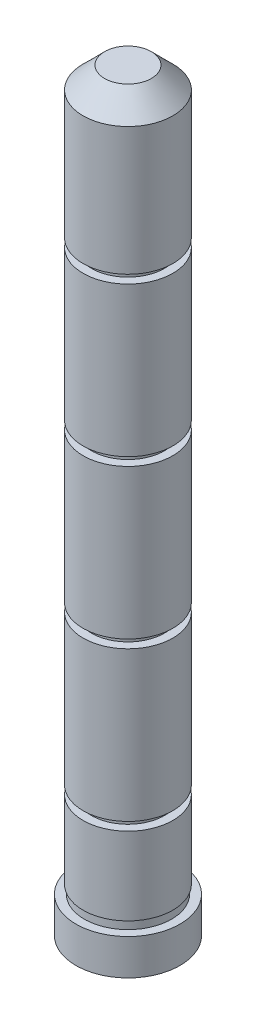
ISO-10303-21;
HEADER;
FILE_DESCRIPTION(('STEP AP214'),'2;1');
FILE_NAME('part.step','',(''),(''),'','','');
FILE_SCHEMA(('AUTOMOTIVE_DESIGN { 1 0 10303 214 1 1 1 1 }'));
ENDSEC;
DATA;
#1=APPLICATION_CONTEXT('core data for automotive mechanical design processes');
#2=APPLICATION_PROTOCOL_DEFINITION('international standard','automotive_design',2000,#1);
#3=PRODUCT_CONTEXT('',#1,'mechanical');
#4=PRODUCT('Part','Part','',(#3));
#5=PRODUCT_RELATED_PRODUCT_CATEGORY('part','',(#4));
#6=PRODUCT_DEFINITION_FORMATION('','',#4);
#7=PRODUCT_DEFINITION_CONTEXT('part definition',#1,'design');
#8=PRODUCT_DEFINITION('design','',#6,#7);
#9=PRODUCT_DEFINITION_SHAPE('','',#8);
#10=(LENGTH_UNIT() NAMED_UNIT(*) SI_UNIT(.MILLI.,.METRE.));
#11=(NAMED_UNIT(*) PLANE_ANGLE_UNIT() SI_UNIT($,.RADIAN.));
#12=(NAMED_UNIT(*) SI_UNIT($,.STERADIAN.) SOLID_ANGLE_UNIT());
#13=UNCERTAINTY_MEASURE_WITH_UNIT(LENGTH_MEASURE(1.E-05),#10,'distance_accuracy_value','');
#14=(GEOMETRIC_REPRESENTATION_CONTEXT(3) GLOBAL_UNCERTAINTY_ASSIGNED_CONTEXT((#13)) GLOBAL_UNIT_ASSIGNED_CONTEXT((#10,
#11,#12)) REPRESENTATION_CONTEXT('',''));
#15=CARTESIAN_POINT('',(0.,0.,0.));
#16=DIRECTION('',(0.,0.,1.));
#17=DIRECTION('',(1.,0.,0.));
#18=AXIS2_PLACEMENT_3D('',#15,#16,#17);
#19=CARTESIAN_POINT('',(0.,0.,0.));
#20=DIRECTION('',(0.,1.,0.));
#21=DIRECTION('',(-1.,0.,0.));
#22=AXIS2_PLACEMENT_3D('',#19,#20,#21);
#23=PLANE('',#22);
#24=CARTESIAN_POINT('',(0.,0.,0.));
#25=DIRECTION('',(0.,1.,0.));
#26=DIRECTION('',(-1.,0.,0.));
#27=AXIS2_PLACEMENT_3D('',#24,#25,#26);
#28=CIRCLE('',#27,14.5);
#29=CARTESIAN_POINT('',(-14.5,0.,0.));
#30=VERTEX_POINT('',#29);
#31=EDGE_CURVE('E55',#30,#30,#28,.T.);
#32=ORIENTED_EDGE('',*,*,#31,.F.);
#33=EDGE_LOOP('',(#32));
#34=FACE_BOUND('',#33,.T.);
#35=ADVANCED_FACE('F43',(#34),#23,.F.);
#36=CARTESIAN_POINT('',(0.,210.,0.));
#37=DIRECTION('',(0.,1.,0.));
#38=DIRECTION('',(-1.,0.,0.));
#39=AXIS2_PLACEMENT_3D('',#36,#37,#38);
#40=CYLINDRICAL_SURFACE('',#39,14.5);
#41=CARTESIAN_POINT('',(0.,10.,0.));
#42=DIRECTION('',(0.,1.,0.));
#43=DIRECTION('',(-1.,0.,0.));
#44=AXIS2_PLACEMENT_3D('',#41,#42,#43);
#45=CIRCLE('',#44,14.5);
#46=CARTESIAN_POINT('',(-14.5,10.,0.));
#47=VERTEX_POINT('',#46);
#48=EDGE_CURVE('E59',#47,#47,#45,.T.);
#49=ORIENTED_EDGE('',*,*,#48,.F.);
#50=EDGE_LOOP('',(#49));
#51=FACE_BOUND('',#50,.T.);
#52=ORIENTED_EDGE('',*,*,#31,.T.);
#53=EDGE_LOOP('',(#52));
#54=FACE_BOUND('',#53,.T.);
#55=ADVANCED_FACE('F235',(#51,#54),#40,.T.);
#56=CARTESIAN_POINT('',(14.5,10.,0.));
#57=DIRECTION('',(0.,-1.,0.));
#58=DIRECTION('',(1.,0.,0.));
#59=AXIS2_PLACEMENT_3D('',#56,#57,#58);
#60=PLANE('',#59);
#61=CARTESIAN_POINT('',(0.,10.,0.));
#62=DIRECTION('',(0.,1.,0.));
#63=DIRECTION('',(-1.,0.,0.));
#64=AXIS2_PLACEMENT_3D('',#61,#62,#63);
#65=CIRCLE('',#64,12.15);
#66=CARTESIAN_POINT('',(-12.15,10.,0.));
#67=VERTEX_POINT('',#66);
#68=EDGE_CURVE('E64',#67,#67,#65,.T.);
#69=ORIENTED_EDGE('',*,*,#68,.F.);
#70=EDGE_LOOP('',(#69));
#71=FACE_BOUND('',#70,.T.);
#72=ORIENTED_EDGE('',*,*,#48,.T.);
#73=EDGE_LOOP('',(#72));
#74=FACE_BOUND('',#73,.T.);
#75=ADVANCED_FACE('F229',(#71,#74),#60,.F.);
#76=CARTESIAN_POINT('',(0.,210.,0.));
#77=DIRECTION('',(0.,1.,0.));
#78=DIRECTION('',(-1.,0.,0.));
#79=AXIS2_PLACEMENT_3D('',#76,#77,#78);
#80=CYLINDRICAL_SURFACE('',#79,12.15);
#81=CARTESIAN_POINT('',(0.,12.35,0.));
#82=DIRECTION('',(0.,1.,0.));
#83=DIRECTION('',(-1.,0.,0.));
#84=AXIS2_PLACEMENT_3D('',#81,#82,#83);
#85=CIRCLE('',#84,12.15);
#86=CARTESIAN_POINT('',(-12.15,12.35,0.));
#87=VERTEX_POINT('',#86);
#88=EDGE_CURVE('E67',#87,#87,#85,.T.);
#89=ORIENTED_EDGE('',*,*,#88,.F.);
#90=EDGE_LOOP('',(#89));
#91=FACE_BOUND('',#90,.T.);
#92=ORIENTED_EDGE('',*,*,#68,.T.);
#93=EDGE_LOOP('',(#92));
#94=FACE_BOUND('',#93,.T.);
#95=ADVANCED_FACE('F223',(#91,#94),#80,.T.);
#96=CARTESIAN_POINT('',(12.15,12.35,0.));
#97=DIRECTION('',(0.,1.,0.));
#98=DIRECTION('',(-1.,0.,0.));
#99=AXIS2_PLACEMENT_3D('',#96,#97,#98);
#100=PLANE('',#99);
#101=CARTESIAN_POINT('',(0.,12.35,0.));
#102=DIRECTION('',(0.,1.,0.));
#103=DIRECTION('',(-1.,0.,0.));
#104=AXIS2_PLACEMENT_3D('',#101,#102,#103);
#105=CIRCLE('',#104,12.5);
#106=CARTESIAN_POINT('',(-12.5,12.35,0.));
#107=VERTEX_POINT('',#106);
#108=EDGE_CURVE('E70',#107,#107,#105,.T.);
#109=ORIENTED_EDGE('',*,*,#108,.F.);
#110=EDGE_LOOP('',(#109));
#111=FACE_BOUND('',#110,.T.);
#112=ORIENTED_EDGE('',*,*,#88,.T.);
#113=EDGE_LOOP('',(#112));
#114=FACE_BOUND('',#113,.T.);
#115=ADVANCED_FACE('F217',(#111,#114),#100,.F.);
#116=CARTESIAN_POINT('',(0.,210.,0.));
#117=DIRECTION('',(0.,1.,0.));
#118=DIRECTION('',(-1.,0.,0.));
#119=AXIS2_PLACEMENT_3D('',#116,#117,#118);
#120=CYLINDRICAL_SURFACE('',#119,12.5);
#121=CARTESIAN_POINT('',(0.,34.,0.));
#122=DIRECTION('',(0.,1.,0.));
#123=DIRECTION('',(-1.,0.,0.));
#124=AXIS2_PLACEMENT_3D('',#121,#122,#123);
#125=CIRCLE('',#124,12.5);
#126=CARTESIAN_POINT('',(-12.5,34.,0.));
#127=VERTEX_POINT('',#126);
#128=EDGE_CURVE('E73',#127,#127,#125,.T.);
#129=ORIENTED_EDGE('',*,*,#128,.F.);
#130=EDGE_LOOP('',(#129));
#131=FACE_BOUND('',#130,.T.);
#132=ORIENTED_EDGE('',*,*,#108,.T.);
#133=EDGE_LOOP('',(#132));
#134=FACE_BOUND('',#133,.T.);
#135=ADVANCED_FACE('F211',(#131,#134),#120,.T.);
#136=CARTESIAN_POINT('',(12.5,34.,0.));
#137=DIRECTION('',(0.,-1.,0.));
#138=DIRECTION('',(1.,0.,0.));
#139=AXIS2_PLACEMENT_3D('',#136,#137,#138);
#140=PLANE('',#139);
#141=CARTESIAN_POINT('',(0.,34.,0.));
#142=DIRECTION('',(0.,1.,0.));
#143=DIRECTION('',(-1.,0.,0.));
#144=AXIS2_PLACEMENT_3D('',#141,#142,#143);
#145=CIRCLE('',#144,10.15);
#146=CARTESIAN_POINT('',(-10.15,34.,0.));
#147=VERTEX_POINT('',#146);
#148=EDGE_CURVE('E76',#147,#147,#145,.T.);
#149=ORIENTED_EDGE('',*,*,#148,.F.);
#150=EDGE_LOOP('',(#149));
#151=FACE_BOUND('',#150,.T.);
#152=ORIENTED_EDGE('',*,*,#128,.T.);
#153=EDGE_LOOP('',(#152));
#154=FACE_BOUND('',#153,.T.);
#155=ADVANCED_FACE('F205',(#151,#154),#140,.F.);
#156=CARTESIAN_POINT('',(0.,210.,0.));
#157=DIRECTION('',(0.,1.,0.));
#158=DIRECTION('',(-1.,0.,0.));
#159=AXIS2_PLACEMENT_3D('',#156,#157,#158);
#160=CYLINDRICAL_SURFACE('',#159,10.15);
#161=CARTESIAN_POINT('',(0.,36.35,0.));
#162=DIRECTION('',(0.,1.,0.));
#163=DIRECTION('',(-1.,0.,0.));
#164=AXIS2_PLACEMENT_3D('',#161,#162,#163);
#165=CIRCLE('',#164,10.15);
#166=CARTESIAN_POINT('',(-10.15,36.35,0.));
#167=VERTEX_POINT('',#166);
#168=EDGE_CURVE('E79',#167,#167,#165,.T.);
#169=ORIENTED_EDGE('',*,*,#168,.F.);
#170=EDGE_LOOP('',(#169));
#171=FACE_BOUND('',#170,.T.);
#172=ORIENTED_EDGE('',*,*,#148,.T.);
#173=EDGE_LOOP('',(#172));
#174=FACE_BOUND('',#173,.T.);
#175=ADVANCED_FACE('F199',(#171,#174),#160,.T.);
#176=CARTESIAN_POINT('',(10.15,36.35,0.));
#177=DIRECTION('',(0.,1.,0.));
#178=DIRECTION('',(-1.,0.,0.));
#179=AXIS2_PLACEMENT_3D('',#176,#177,#178);
#180=PLANE('',#179);
#181=CARTESIAN_POINT('',(0.,36.35,0.));
#182=DIRECTION('',(0.,1.,0.));
#183=DIRECTION('',(-1.,0.,0.));
#184=AXIS2_PLACEMENT_3D('',#181,#182,#183);
#185=CIRCLE('',#184,12.5);
#186=CARTESIAN_POINT('',(-12.5,36.35,0.));
#187=VERTEX_POINT('',#186);
#188=EDGE_CURVE('E82',#187,#187,#185,.T.);
#189=ORIENTED_EDGE('',*,*,#188,.F.);
#190=EDGE_LOOP('',(#189));
#191=FACE_BOUND('',#190,.T.);
#192=ORIENTED_EDGE('',*,*,#168,.T.);
#193=EDGE_LOOP('',(#192));
#194=FACE_BOUND('',#193,.T.);
#195=ADVANCED_FACE('F193',(#191,#194),#180,.F.);
#196=CARTESIAN_POINT('',(0.,210.,0.));
#197=DIRECTION('',(0.,1.,0.));
#198=DIRECTION('',(-1.,0.,0.));
#199=AXIS2_PLACEMENT_3D('',#196,#197,#198);
#200=CYLINDRICAL_SURFACE('',#199,12.5);
#201=CARTESIAN_POINT('',(0.,78.,0.));
#202=DIRECTION('',(0.,1.,0.));
#203=DIRECTION('',(-1.,0.,0.));
#204=AXIS2_PLACEMENT_3D('',#201,#202,#203);
#205=CIRCLE('',#204,12.5);
#206=CARTESIAN_POINT('',(-12.5,78.,0.));
#207=VERTEX_POINT('',#206);
#208=EDGE_CURVE('E85',#207,#207,#205,.T.);
#209=ORIENTED_EDGE('',*,*,#208,.F.);
#210=EDGE_LOOP('',(#209));
#211=FACE_BOUND('',#210,.T.);
#212=ORIENTED_EDGE('',*,*,#188,.T.);
#213=EDGE_LOOP('',(#212));
#214=FACE_BOUND('',#213,.T.);
#215=ADVANCED_FACE('F187',(#211,#214),#200,.T.);
#216=CARTESIAN_POINT('',(12.5,78.,0.));
#217=DIRECTION('',(0.,-1.,0.));
#218=DIRECTION('',(1.,0.,0.));
#219=AXIS2_PLACEMENT_3D('',#216,#217,#218);
#220=PLANE('',#219);
#221=CARTESIAN_POINT('',(0.,78.,0.));
#222=DIRECTION('',(0.,1.,0.));
#223=DIRECTION('',(-1.,0.,0.));
#224=AXIS2_PLACEMENT_3D('',#221,#222,#223);
#225=CIRCLE('',#224,10.15);
#226=CARTESIAN_POINT('',(-10.15,78.,0.));
#227=VERTEX_POINT('',#226);
#228=EDGE_CURVE('E88',#227,#227,#225,.T.);
#229=ORIENTED_EDGE('',*,*,#228,.F.);
#230=EDGE_LOOP('',(#229));
#231=FACE_BOUND('',#230,.T.);
#232=ORIENTED_EDGE('',*,*,#208,.T.);
#233=EDGE_LOOP('',(#232));
#234=FACE_BOUND('',#233,.T.);
#235=ADVANCED_FACE('F181',(#231,#234),#220,.F.);
#236=CARTESIAN_POINT('',(0.,210.,0.));
#237=DIRECTION('',(0.,1.,0.));
#238=DIRECTION('',(-1.,0.,0.));
#239=AXIS2_PLACEMENT_3D('',#236,#237,#238);
#240=CYLINDRICAL_SURFACE('',#239,10.15);
#241=CARTESIAN_POINT('',(0.,80.35,0.));
#242=DIRECTION('',(0.,1.,0.));
#243=DIRECTION('',(-1.,0.,0.));
#244=AXIS2_PLACEMENT_3D('',#241,#242,#243);
#245=CIRCLE('',#244,10.15);
#246=CARTESIAN_POINT('',(-10.15,80.35,0.));
#247=VERTEX_POINT('',#246);
#248=EDGE_CURVE('E91',#247,#247,#245,.T.);
#249=ORIENTED_EDGE('',*,*,#248,.F.);
#250=EDGE_LOOP('',(#249));
#251=FACE_BOUND('',#250,.T.);
#252=ORIENTED_EDGE('',*,*,#228,.T.);
#253=EDGE_LOOP('',(#252));
#254=FACE_BOUND('',#253,.T.);
#255=ADVANCED_FACE('F175',(#251,#254),#240,.T.);
#256=CARTESIAN_POINT('',(10.15,80.35,0.));
#257=DIRECTION('',(0.,1.,0.));
#258=DIRECTION('',(-1.,0.,0.));
#259=AXIS2_PLACEMENT_3D('',#256,#257,#258);
#260=PLANE('',#259);
#261=CARTESIAN_POINT('',(0.,80.35,0.));
#262=DIRECTION('',(0.,1.,0.));
#263=DIRECTION('',(-1.,0.,0.));
#264=AXIS2_PLACEMENT_3D('',#261,#262,#263);
#265=CIRCLE('',#264,12.5);
#266=CARTESIAN_POINT('',(-12.5,80.35,0.));
#267=VERTEX_POINT('',#266);
#268=EDGE_CURVE('E94',#267,#267,#265,.T.);
#269=ORIENTED_EDGE('',*,*,#268,.F.);
#270=EDGE_LOOP('',(#269));
#271=FACE_BOUND('',#270,.T.);
#272=ORIENTED_EDGE('',*,*,#248,.T.);
#273=EDGE_LOOP('',(#272));
#274=FACE_BOUND('',#273,.T.);
#275=ADVANCED_FACE('F169',(#271,#274),#260,.F.);
#276=CARTESIAN_POINT('',(0.,210.,0.));
#277=DIRECTION('',(0.,1.,0.));
#278=DIRECTION('',(-1.,0.,0.));
#279=AXIS2_PLACEMENT_3D('',#276,#277,#278);
#280=CYLINDRICAL_SURFACE('',#279,12.5);
#281=CARTESIAN_POINT('',(0.,122.,0.));
#282=DIRECTION('',(0.,1.,0.));
#283=DIRECTION('',(-1.,0.,0.));
#284=AXIS2_PLACEMENT_3D('',#281,#282,#283);
#285=CIRCLE('',#284,12.5);
#286=CARTESIAN_POINT('',(-12.5,122.,0.));
#287=VERTEX_POINT('',#286);
#288=EDGE_CURVE('E97',#287,#287,#285,.T.);
#289=ORIENTED_EDGE('',*,*,#288,.F.);
#290=EDGE_LOOP('',(#289));
#291=FACE_BOUND('',#290,.T.);
#292=ORIENTED_EDGE('',*,*,#268,.T.);
#293=EDGE_LOOP('',(#292));
#294=FACE_BOUND('',#293,.T.);
#295=ADVANCED_FACE('F163',(#291,#294),#280,.T.);
#296=CARTESIAN_POINT('',(12.5,122.,0.));
#297=DIRECTION('',(0.,-1.,0.));
#298=DIRECTION('',(1.,0.,0.));
#299=AXIS2_PLACEMENT_3D('',#296,#297,#298);
#300=PLANE('',#299);
#301=CARTESIAN_POINT('',(0.,122.,0.));
#302=DIRECTION('',(0.,1.,0.));
#303=DIRECTION('',(-1.,0.,0.));
#304=AXIS2_PLACEMENT_3D('',#301,#302,#303);
#305=CIRCLE('',#304,10.15);
#306=CARTESIAN_POINT('',(-10.15,122.,0.));
#307=VERTEX_POINT('',#306);
#308=EDGE_CURVE('E100',#307,#307,#305,.T.);
#309=ORIENTED_EDGE('',*,*,#308,.F.);
#310=EDGE_LOOP('',(#309));
#311=FACE_BOUND('',#310,.T.);
#312=ORIENTED_EDGE('',*,*,#288,.T.);
#313=EDGE_LOOP('',(#312));
#314=FACE_BOUND('',#313,.T.);
#315=ADVANCED_FACE('F157',(#311,#314),#300,.F.);
#316=CARTESIAN_POINT('',(0.,210.,0.));
#317=DIRECTION('',(0.,1.,0.));
#318=DIRECTION('',(-1.,0.,0.));
#319=AXIS2_PLACEMENT_3D('',#316,#317,#318);
#320=CYLINDRICAL_SURFACE('',#319,10.15);
#321=CARTESIAN_POINT('',(0.,124.35,0.));
#322=DIRECTION('',(0.,1.,0.));
#323=DIRECTION('',(-1.,0.,0.));
#324=AXIS2_PLACEMENT_3D('',#321,#322,#323);
#325=CIRCLE('',#324,10.15);
#326=CARTESIAN_POINT('',(-10.15,124.35,0.));
#327=VERTEX_POINT('',#326);
#328=EDGE_CURVE('E103',#327,#327,#325,.T.);
#329=ORIENTED_EDGE('',*,*,#328,.F.);
#330=EDGE_LOOP('',(#329));
#331=FACE_BOUND('',#330,.T.);
#332=ORIENTED_EDGE('',*,*,#308,.T.);
#333=EDGE_LOOP('',(#332));
#334=FACE_BOUND('',#333,.T.);
#335=ADVANCED_FACE('F151',(#331,#334),#320,.T.);
#336=CARTESIAN_POINT('',(10.15,124.35,0.));
#337=DIRECTION('',(0.,1.,0.));
#338=DIRECTION('',(-1.,0.,0.));
#339=AXIS2_PLACEMENT_3D('',#336,#337,#338);
#340=PLANE('',#339);
#341=CARTESIAN_POINT('',(0.,124.35,0.));
#342=DIRECTION('',(0.,1.,0.));
#343=DIRECTION('',(-1.,0.,0.));
#344=AXIS2_PLACEMENT_3D('',#341,#342,#343);
#345=CIRCLE('',#344,12.5);
#346=CARTESIAN_POINT('',(-12.5,124.35,0.));
#347=VERTEX_POINT('',#346);
#348=EDGE_CURVE('E106',#347,#347,#345,.T.);
#349=ORIENTED_EDGE('',*,*,#348,.F.);
#350=EDGE_LOOP('',(#349));
#351=FACE_BOUND('',#350,.T.);
#352=ORIENTED_EDGE('',*,*,#328,.T.);
#353=EDGE_LOOP('',(#352));
#354=FACE_BOUND('',#353,.T.);
#355=ADVANCED_FACE('F145',(#351,#354),#340,.F.);
#356=CARTESIAN_POINT('',(0.,210.,0.));
#357=DIRECTION('',(0.,1.,0.));
#358=DIRECTION('',(-1.,0.,0.));
#359=AXIS2_PLACEMENT_3D('',#356,#357,#358);
#360=CYLINDRICAL_SURFACE('',#359,12.5);
#361=CARTESIAN_POINT('',(0.,166.,0.));
#362=DIRECTION('',(0.,1.,0.));
#363=DIRECTION('',(-1.,0.,0.));
#364=AXIS2_PLACEMENT_3D('',#361,#362,#363);
#365=CIRCLE('',#364,12.5);
#366=CARTESIAN_POINT('',(-12.5,166.,0.));
#367=VERTEX_POINT('',#366);
#368=EDGE_CURVE('E109',#367,#367,#365,.T.);
#369=ORIENTED_EDGE('',*,*,#368,.F.);
#370=EDGE_LOOP('',(#369));
#371=FACE_BOUND('',#370,.T.);
#372=ORIENTED_EDGE('',*,*,#348,.T.);
#373=EDGE_LOOP('',(#372));
#374=FACE_BOUND('',#373,.T.);
#375=ADVANCED_FACE('F139',(#371,#374),#360,.T.);
#376=CARTESIAN_POINT('',(12.5,166.,0.));
#377=DIRECTION('',(0.,-1.,0.));
#378=DIRECTION('',(1.,0.,0.));
#379=AXIS2_PLACEMENT_3D('',#376,#377,#378);
#380=PLANE('',#379);
#381=CARTESIAN_POINT('',(0.,166.,0.));
#382=DIRECTION('',(0.,1.,0.));
#383=DIRECTION('',(-1.,0.,0.));
#384=AXIS2_PLACEMENT_3D('',#381,#382,#383);
#385=CIRCLE('',#384,10.15);
#386=CARTESIAN_POINT('',(-10.15,166.,0.));
#387=VERTEX_POINT('',#386);
#388=EDGE_CURVE('E112',#387,#387,#385,.T.);
#389=ORIENTED_EDGE('',*,*,#388,.F.);
#390=EDGE_LOOP('',(#389));
#391=FACE_BOUND('',#390,.T.);
#392=ORIENTED_EDGE('',*,*,#368,.T.);
#393=EDGE_LOOP('',(#392));
#394=FACE_BOUND('',#393,.T.);
#395=ADVANCED_FACE('F133',(#391,#394),#380,.F.);
#396=CARTESIAN_POINT('',(0.,210.,0.));
#397=DIRECTION('',(0.,1.,0.));
#398=DIRECTION('',(-1.,0.,0.));
#399=AXIS2_PLACEMENT_3D('',#396,#397,#398);
#400=CYLINDRICAL_SURFACE('',#399,10.15);
#401=CARTESIAN_POINT('',(0.,168.35,0.));
#402=DIRECTION('',(0.,1.,0.));
#403=DIRECTION('',(-1.,0.,0.));
#404=AXIS2_PLACEMENT_3D('',#401,#402,#403);
#405=CIRCLE('',#404,10.15);
#406=CARTESIAN_POINT('',(-10.15,168.35,0.));
#407=VERTEX_POINT('',#406);
#408=EDGE_CURVE('E115',#407,#407,#405,.T.);
#409=ORIENTED_EDGE('',*,*,#408,.F.);
#410=EDGE_LOOP('',(#409));
#411=FACE_BOUND('',#410,.T.);
#412=ORIENTED_EDGE('',*,*,#388,.T.);
#413=EDGE_LOOP('',(#412));
#414=FACE_BOUND('',#413,.T.);
#415=ADVANCED_FACE('F127',(#411,#414),#400,.T.);
#416=CARTESIAN_POINT('',(10.15,168.35,0.));
#417=DIRECTION('',(0.,1.,0.));
#418=DIRECTION('',(-1.,0.,0.));
#419=AXIS2_PLACEMENT_3D('',#416,#417,#418);
#420=PLANE('',#419);
#421=CARTESIAN_POINT('',(0.,168.35,0.));
#422=DIRECTION('',(0.,1.,0.));
#423=DIRECTION('',(-1.,0.,0.));
#424=AXIS2_PLACEMENT_3D('',#421,#422,#423);
#425=CIRCLE('',#424,12.5);
#426=CARTESIAN_POINT('',(-12.5,168.35,0.));
#427=VERTEX_POINT('',#426);
#428=EDGE_CURVE('E118',#427,#427,#425,.T.);
#429=ORIENTED_EDGE('',*,*,#428,.F.);
#430=EDGE_LOOP('',(#429));
#431=FACE_BOUND('',#430,.T.);
#432=ORIENTED_EDGE('',*,*,#408,.T.);
#433=EDGE_LOOP('',(#432));
#434=FACE_BOUND('',#433,.T.);
#435=ADVANCED_FACE('F124',(#431,#434),#420,.F.);
#436=CARTESIAN_POINT('',(0.,210.,0.));
#437=DIRECTION('',(0.,1.,0.));
#438=DIRECTION('',(-1.,0.,0.));
#439=AXIS2_PLACEMENT_3D('',#436,#437,#438);
#440=CYLINDRICAL_SURFACE('',#439,12.5);
#441=CARTESIAN_POINT('',(0.,204.,0.));
#442=DIRECTION('',(0.,-1.,0.));
#443=DIRECTION('',(1.,0.,0.));
#444=AXIS2_PLACEMENT_3D('',#441,#442,#443);
#445=CIRCLE('',#444,12.5);
#446=CARTESIAN_POINT('',(12.5,204.,0.));
#447=VERTEX_POINT('',#446);
#448=EDGE_CURVE('E10',#447,#447,#445,.T.);
#449=ORIENTED_EDGE('',*,*,#448,.T.);
#450=EDGE_LOOP('',(#449));
#451=FACE_BOUND('',#450,.T.);
#452=ORIENTED_EDGE('',*,*,#428,.T.);
#453=EDGE_LOOP('',(#452));
#454=FACE_BOUND('',#453,.T.);
#455=ADVANCED_FACE('F122',(#451,#454),#440,.T.);
#456=CARTESIAN_POINT('',(12.5,210.,0.));
#457=DIRECTION('',(0.,-1.,0.));
#458=DIRECTION('',(1.,0.,0.));
#459=AXIS2_PLACEMENT_3D('',#456,#457,#458);
#460=PLANE('',#459);
#461=CARTESIAN_POINT('',(0.,210.,0.));
#462=DIRECTION('',(0.,-1.,0.));
#463=DIRECTION('',(1.,0.,0.));
#464=AXIS2_PLACEMENT_3D('',#461,#462,#463);
#465=CIRCLE('',#464,6.49999999999995);
#466=CARTESIAN_POINT('',(6.49999999999993,210.,0.));
#467=VERTEX_POINT('',#466);
#468=EDGE_CURVE('E51',#467,#467,#465,.F.);
#469=ORIENTED_EDGE('',*,*,#468,.T.);
#470=EDGE_LOOP('',(#469));
#471=FACE_BOUND('',#470,.T.);
#472=ADVANCED_FACE('F250',(#471),#460,.F.);
#473=CARTESIAN_POINT('',(0.,210.,0.));
#474=DIRECTION('',(0.,-1.,0.));
#475=DIRECTION('',(1.,0.,0.));
#476=AXIS2_PLACEMENT_3D('',#473,#474,#475);
#477=CONICAL_SURFACE('',#476,6.49999999999995,0.785398163397448);
#478=ORIENTED_EDGE('',*,*,#448,.F.);
#479=EDGE_LOOP('',(#478));
#480=FACE_BOUND('',#479,.T.);
#481=ORIENTED_EDGE('',*,*,#468,.F.);
#482=EDGE_LOOP('',(#481));
#483=FACE_BOUND('',#482,.T.);
#484=ADVANCED_FACE('F46',(#480,#483),#477,.T.);
#485=CLOSED_SHELL('',(#35,#55,#75,#95,#115,#135,#155,#175,#195,#215,#235,#255,#275,#295,#315,
#335,#355,#375,#395,#415,#435,#455,#472,#484));
#486=MANIFOLD_SOLID_BREP('B2',#485);
#487=ADVANCED_BREP_SHAPE_REPRESENTATION('',(#18,#486),#14);
#488=SHAPE_DEFINITION_REPRESENTATION(#9,#487);
ENDSEC;
END-ISO-10303-21;
